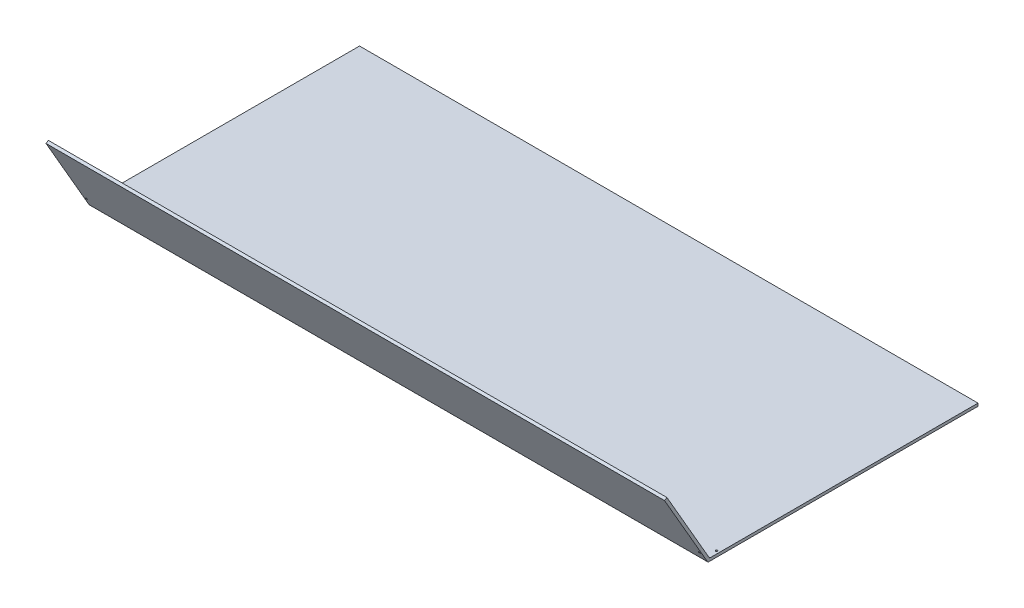
ISO-10303-21;
HEADER;
FILE_DESCRIPTION(('STEP AP214'),'2;1');
FILE_NAME('part.step','',(''),(''),'','','');
FILE_SCHEMA(('AUTOMOTIVE_DESIGN { 1 0 10303 214 1 1 1 1 }'));
ENDSEC;
DATA;
#1=APPLICATION_CONTEXT('core data for automotive mechanical design processes');
#2=APPLICATION_PROTOCOL_DEFINITION('international standard','automotive_design',2000,#1);
#3=PRODUCT_CONTEXT('',#1,'mechanical');
#4=PRODUCT('Part','Part','',(#3));
#5=PRODUCT_RELATED_PRODUCT_CATEGORY('part','',(#4));
#6=PRODUCT_DEFINITION_FORMATION('','',#4);
#7=PRODUCT_DEFINITION_CONTEXT('part definition',#1,'design');
#8=PRODUCT_DEFINITION('design','',#6,#7);
#9=PRODUCT_DEFINITION_SHAPE('','',#8);
#10=(LENGTH_UNIT() NAMED_UNIT(*) SI_UNIT(.MILLI.,.METRE.));
#11=(NAMED_UNIT(*) PLANE_ANGLE_UNIT() SI_UNIT($,.RADIAN.));
#12=(NAMED_UNIT(*) SI_UNIT($,.STERADIAN.) SOLID_ANGLE_UNIT());
#13=UNCERTAINTY_MEASURE_WITH_UNIT(LENGTH_MEASURE(1.E-05),#10,'distance_accuracy_value','');
#14=(GEOMETRIC_REPRESENTATION_CONTEXT(3) GLOBAL_UNCERTAINTY_ASSIGNED_CONTEXT((#13)) GLOBAL_UNIT_ASSIGNED_CONTEXT((#10,
#11,#12)) REPRESENTATION_CONTEXT('',''));
#15=CARTESIAN_POINT('',(0.,0.,0.));
#16=DIRECTION('',(0.,0.,1.));
#17=DIRECTION('',(1.,0.,0.));
#18=AXIS2_PLACEMENT_3D('',#15,#16,#17);
#19=CARTESIAN_POINT('',(525.018,4.7625,228.6));
#20=DIRECTION('',(-1.,0.,0.));
#21=DIRECTION('',(0.,0.,1.));
#22=AXIS2_PLACEMENT_3D('',#19,#20,#21);
#23=PLANE('',#22);
#24=DIRECTION('',(0.,0.,-1.));
#25=VECTOR('',#24,1.);
#26=CARTESIAN_POINT('',(525.018,4.7625,228.6));
#27=LINE('',#26,#25);
#28=CARTESIAN_POINT('',(525.018,4.7625,225.850369342984));
#29=VERTEX_POINT('',#28);
#30=CARTESIAN_POINT('',(525.018,4.7625,-228.6));
#31=VERTEX_POINT('',#30);
#32=EDGE_CURVE('E149',#29,#31,#27,.T.);
#33=ORIENTED_EDGE('',*,*,#32,.F.);
#34=CARTESIAN_POINT('',(525.018,7.14375,225.850369342984));
#35=DIRECTION('',(-1.,0.,0.));
#36=DIRECTION('',(0.,0.,1.));
#37=AXIS2_PLACEMENT_3D('',#34,#35,#36);
#38=CIRCLE('',#37,2.38125);
#39=CARTESIAN_POINT('',(525.018,5.95312499999997,227.912592335746));
#40=VERTEX_POINT('',#39);
#41=EDGE_CURVE('E43',#29,#40,#38,.T.);
#42=ORIENTED_EDGE('',*,*,#41,.T.);
#43=DIRECTION('',(0.,0.866025403784436,0.500000000000004));
#44=VECTOR('',#43,1.);
#45=CARTESIAN_POINT('',(525.018,3.57187499999997,226.537777007238));
#46=LINE('',#45,#44);
#47=CARTESIAN_POINT('',(525.018,130.054885222717,299.562777007239));
#48=VERTEX_POINT('',#47);
#49=EDGE_CURVE('E113',#40,#48,#46,.T.);
#50=ORIENTED_EDGE('',*,*,#49,.T.);
#51=DIRECTION('',(0.,0.500000000000004,-0.866025403784436));
#52=VECTOR('',#51,1.);
#53=CARTESIAN_POINT('',(525.018,28.3885923074525,475.653961753655));
#54=LINE('',#53,#52);
#55=CARTESIAN_POINT('',(525.018,127.673635222717,303.687222992762));
#56=VERTEX_POINT('',#55);
#57=EDGE_CURVE('E102',#56,#48,#54,.T.);
#58=ORIENTED_EDGE('',*,*,#57,.F.);
#59=DIRECTION('',(0.,0.866025403784436,0.500000000000004));
#60=VECTOR('',#59,1.);
#61=CARTESIAN_POINT('',(525.018,1.19062499999996,230.662222992762));
#62=LINE('',#61,#60);
#63=CARTESIAN_POINT('',(525.018,1.19062499999996,230.662222992762));
#64=VERTEX_POINT('',#63);
#65=EDGE_CURVE('E112',#64,#56,#62,.T.);
#66=ORIENTED_EDGE('',*,*,#65,.F.);
#67=CARTESIAN_POINT('',(525.018,2.38125,228.6));
#68=DIRECTION('',(-1.,0.,0.));
#69=DIRECTION('',(0.,0.,1.));
#70=AXIS2_PLACEMENT_3D('',#67,#68,#69);
#71=CIRCLE('',#70,2.38125);
#72=CARTESIAN_POINT('',(525.018,0.,228.6));
#73=VERTEX_POINT('',#72);
#74=EDGE_CURVE('E144',#64,#73,#71,.F.);
#75=ORIENTED_EDGE('',*,*,#74,.T.);
#76=DIRECTION('',(0.,0.,-1.));
#77=VECTOR('',#76,1.);
#78=CARTESIAN_POINT('',(525.018,0.,228.6));
#79=LINE('',#78,#77);
#80=CARTESIAN_POINT('',(525.018,0.,-228.6));
#81=VERTEX_POINT('',#80);
#82=EDGE_CURVE('E146',#73,#81,#79,.T.);
#83=ORIENTED_EDGE('',*,*,#82,.T.);
#84=DIRECTION('',(0.,-1.,0.));
#85=VECTOR('',#84,1.);
#86=CARTESIAN_POINT('',(525.018,4.7625,-228.6));
#87=LINE('',#86,#85);
#88=EDGE_CURVE('E168',#31,#81,#87,.T.);
#89=ORIENTED_EDGE('',*,*,#88,.F.);
#90=EDGE_LOOP('',(#33,#42,#50,#58,#66,#75,#83,#89));
#91=FACE_BOUND('',#90,.T.);
#92=ADVANCED_FACE('F35',(#91),#23,.F.);
#93=CARTESIAN_POINT('',(-525.018,4.7625,-228.6));
#94=DIRECTION('',(0.,0.,1.));
#95=DIRECTION('',(1.,0.,0.));
#96=AXIS2_PLACEMENT_3D('',#93,#94,#95);
#97=PLANE('',#96);
#98=DIRECTION('',(-1.,0.,0.));
#99=VECTOR('',#98,1.);
#100=CARTESIAN_POINT('',(-525.018,0.,-228.6));
#101=LINE('',#100,#99);
#102=CARTESIAN_POINT('',(-525.018,0.,-228.6));
#103=VERTEX_POINT('',#102);
#104=EDGE_CURVE('E160',#81,#103,#101,.T.);
#105=ORIENTED_EDGE('',*,*,#104,.T.);
#106=DIRECTION('',(0.,-1.,0.));
#107=VECTOR('',#106,1.);
#108=CARTESIAN_POINT('',(-525.018,4.7625,-228.6));
#109=LINE('',#108,#107);
#110=CARTESIAN_POINT('',(-525.018,4.7625,-228.6));
#111=VERTEX_POINT('',#110);
#112=EDGE_CURVE('E157',#111,#103,#109,.T.);
#113=ORIENTED_EDGE('',*,*,#112,.F.);
#114=DIRECTION('',(-1.,0.,0.));
#115=VECTOR('',#114,1.);
#116=CARTESIAN_POINT('',(-525.018,4.7625,-228.6));
#117=LINE('',#116,#115);
#118=EDGE_CURVE('E151',#31,#111,#117,.T.);
#119=ORIENTED_EDGE('',*,*,#118,.F.);
#120=ORIENTED_EDGE('',*,*,#88,.T.);
#121=EDGE_LOOP('',(#105,#113,#119,#120));
#122=FACE_BOUND('',#121,.T.);
#123=ADVANCED_FACE('F184',(#122),#97,.F.);
#124=CARTESIAN_POINT('',(-525.018,4.7625,228.6));
#125=DIRECTION('',(1.,0.,0.));
#126=DIRECTION('',(0.,0.,-1.));
#127=AXIS2_PLACEMENT_3D('',#124,#125,#126);
#128=PLANE('',#127);
#129=DIRECTION('',(0.,-0.866025403784436,-0.500000000000004));
#130=VECTOR('',#129,1.);
#131=CARTESIAN_POINT('',(-525.018,1.19062499999996,230.662222992762));
#132=LINE('',#131,#130);
#133=CARTESIAN_POINT('',(-525.018,127.673635222717,303.687222992762));
#134=VERTEX_POINT('',#133);
#135=CARTESIAN_POINT('',(-525.018,1.19062499999999,230.662222992762));
#136=VERTEX_POINT('',#135);
#137=EDGE_CURVE('E120',#134,#136,#132,.T.);
#138=ORIENTED_EDGE('',*,*,#137,.F.);
#139=DIRECTION('',(0.,0.500000000000004,-0.866025403784436));
#140=VECTOR('',#139,1.);
#141=CARTESIAN_POINT('',(-525.018,28.3885923074525,475.653961753655));
#142=LINE('',#141,#140);
#143=CARTESIAN_POINT('',(-525.018,130.054885222717,299.562777007239));
#144=VERTEX_POINT('',#143);
#145=EDGE_CURVE('E105',#134,#144,#142,.T.);
#146=ORIENTED_EDGE('',*,*,#145,.T.);
#147=DIRECTION('',(0.,-0.866025403784436,-0.500000000000004));
#148=VECTOR('',#147,1.);
#149=CARTESIAN_POINT('',(-525.018,3.57187499999997,226.537777007238));
#150=LINE('',#149,#148);
#151=CARTESIAN_POINT('',(-525.018,5.95312499999997,227.912592335746));
#152=VERTEX_POINT('',#151);
#153=EDGE_CURVE('E121',#144,#152,#150,.T.);
#154=ORIENTED_EDGE('',*,*,#153,.T.);
#155=CARTESIAN_POINT('',(-525.018,7.14375,225.850369342984));
#156=DIRECTION('',(1.,0.,0.));
#157=DIRECTION('',(0.,0.,-1.));
#158=AXIS2_PLACEMENT_3D('',#155,#156,#157);
#159=CIRCLE('',#158,2.38125);
#160=CARTESIAN_POINT('',(-525.018,4.7625,225.850369342984));
#161=VERTEX_POINT('',#160);
#162=EDGE_CURVE('E11',#152,#161,#159,.T.);
#163=ORIENTED_EDGE('',*,*,#162,.T.);
#164=DIRECTION('',(0.,0.,1.));
#165=VECTOR('',#164,1.);
#166=CARTESIAN_POINT('',(-525.018,4.7625,228.6));
#167=LINE('',#166,#165);
#168=EDGE_CURVE('E154',#111,#161,#167,.T.);
#169=ORIENTED_EDGE('',*,*,#168,.F.);
#170=ORIENTED_EDGE('',*,*,#112,.T.);
#171=DIRECTION('',(0.,0.,1.));
#172=VECTOR('',#171,1.);
#173=CARTESIAN_POINT('',(-525.018,0.,228.6));
#174=LINE('',#173,#172);
#175=CARTESIAN_POINT('',(-525.018,0.,228.6));
#176=VERTEX_POINT('',#175);
#177=EDGE_CURVE('E162',#103,#176,#174,.T.);
#178=ORIENTED_EDGE('',*,*,#177,.T.);
#179=CARTESIAN_POINT('',(-525.018,2.38125,228.6));
#180=DIRECTION('',(-1.,0.,0.));
#181=DIRECTION('',(0.,0.,1.));
#182=AXIS2_PLACEMENT_3D('',#179,#180,#181);
#183=CIRCLE('',#182,2.38125);
#184=EDGE_CURVE('E135',#176,#136,#183,.T.);
#185=ORIENTED_EDGE('',*,*,#184,.T.);
#186=EDGE_LOOP('',(#138,#146,#154,#163,#169,#170,#178,#185));
#187=FACE_BOUND('',#186,.T.);
#188=ADVANCED_FACE('F188',(#187),#128,.F.);
#189=CARTESIAN_POINT('',(0.,4.7625,0.));
#190=DIRECTION('',(0.,-1.,0.));
#191=DIRECTION('',(0.,0.,-1.));
#192=AXIS2_PLACEMENT_3D('',#189,#190,#191);
#193=PLANE('',#192);
#194=CARTESIAN_POINT('',(520.2555,4.7625,210.3923148));
#195=DIRECTION('',(0.,1.,0.));
#196=DIRECTION('',(0.,0.,1.));
#197=AXIS2_PLACEMENT_3D('',#194,#195,#196);
#198=CIRCLE('',#197,1.58750000000005);
#199=CARTESIAN_POINT('',(520.2555,4.7625,211.9798148));
#200=VERTEX_POINT('',#199);
#201=EDGE_CURVE('E136',#200,#200,#198,.T.);
#202=ORIENTED_EDGE('',*,*,#201,.F.);
#203=EDGE_LOOP('',(#202));
#204=FACE_BOUND('',#203,.T.);
#205=CARTESIAN_POINT('',(-520.2555,4.7625,210.3923148));
#206=DIRECTION('',(0.,1.,0.));
#207=DIRECTION('',(0.,0.,1.));
#208=AXIS2_PLACEMENT_3D('',#205,#206,#207);
#209=CIRCLE('',#208,1.58750000000005);
#210=CARTESIAN_POINT('',(-520.2555,4.7625,211.9798148));
#211=VERTEX_POINT('',#210);
#212=EDGE_CURVE('E130',#211,#211,#209,.T.);
#213=ORIENTED_EDGE('',*,*,#212,.F.);
#214=EDGE_LOOP('',(#213));
#215=FACE_BOUND('',#214,.T.);
#216=ORIENTED_EDGE('',*,*,#168,.T.);
#217=DIRECTION('',(1.,0.,0.));
#218=VECTOR('',#217,1.);
#219=CARTESIAN_POINT('',(0.,4.7625,225.850369342984));
#220=LINE('',#219,#218);
#221=EDGE_CURVE('E171',#161,#29,#220,.T.);
#222=ORIENTED_EDGE('',*,*,#221,.T.);
#223=ORIENTED_EDGE('',*,*,#32,.T.);
#224=ORIENTED_EDGE('',*,*,#118,.T.);
#225=EDGE_LOOP('',(#216,#222,#223,#224));
#226=FACE_BOUND('',#225,.T.);
#227=ADVANCED_FACE('F176',(#204,#215,#226),#193,.F.);
#228=CARTESIAN_POINT('',(0.,0.,0.));
#229=DIRECTION('',(0.,-1.,0.));
#230=DIRECTION('',(0.,0.,-1.));
#231=AXIS2_PLACEMENT_3D('',#228,#229,#230);
#232=PLANE('',#231);
#233=CARTESIAN_POINT('',(520.2555,0.,210.3923148));
#234=DIRECTION('',(0.,1.,0.));
#235=DIRECTION('',(0.,0.,1.));
#236=AXIS2_PLACEMENT_3D('',#233,#234,#235);
#237=CIRCLE('',#236,1.58750000000005);
#238=CARTESIAN_POINT('',(520.2555,0.,211.9798148));
#239=VERTEX_POINT('',#238);
#240=EDGE_CURVE('E132',#239,#239,#237,.T.);
#241=ORIENTED_EDGE('',*,*,#240,.T.);
#242=EDGE_LOOP('',(#241));
#243=FACE_BOUND('',#242,.T.);
#244=CARTESIAN_POINT('',(-520.2555,0.,210.3923148));
#245=DIRECTION('',(0.,1.,0.));
#246=DIRECTION('',(0.,0.,1.));
#247=AXIS2_PLACEMENT_3D('',#244,#245,#246);
#248=CIRCLE('',#247,1.58750000000005);
#249=CARTESIAN_POINT('',(-520.2555,0.,211.9798148));
#250=VERTEX_POINT('',#249);
#251=EDGE_CURVE('E139',#250,#250,#248,.T.);
#252=ORIENTED_EDGE('',*,*,#251,.T.);
#253=EDGE_LOOP('',(#252));
#254=FACE_BOUND('',#253,.T.);
#255=ORIENTED_EDGE('',*,*,#82,.F.);
#256=DIRECTION('',(1.,0.,0.));
#257=VECTOR('',#256,1.);
#258=CARTESIAN_POINT('',(-525.018,0.,228.6));
#259=LINE('',#258,#257);
#260=EDGE_CURVE('E152',#176,#73,#259,.T.);
#261=ORIENTED_EDGE('',*,*,#260,.F.);
#262=ORIENTED_EDGE('',*,*,#177,.F.);
#263=ORIENTED_EDGE('',*,*,#104,.F.);
#264=EDGE_LOOP('',(#255,#261,#262,#263));
#265=FACE_BOUND('',#264,.T.);
#266=ADVANCED_FACE('F203',(#243,#254,#265),#232,.T.);
#267=CARTESIAN_POINT('',(530.342636871421,2.38125,228.6));
#268=DIRECTION('',(-1.,0.,0.));
#269=DIRECTION('',(0.,0.,1.));
#270=AXIS2_PLACEMENT_3D('',#267,#268,#269);
#271=CYLINDRICAL_SURFACE('',#270,2.38125);
#272=DIRECTION('',(1.,0.,0.));
#273=VECTOR('',#272,1.);
#274=CARTESIAN_POINT('',(-525.018,1.19062499999996,230.662222992762));
#275=LINE('',#274,#273);
#276=EDGE_CURVE('E119',#136,#64,#275,.T.);
#277=ORIENTED_EDGE('',*,*,#276,.F.);
#278=ORIENTED_EDGE('',*,*,#184,.F.);
#279=ORIENTED_EDGE('',*,*,#260,.T.);
#280=ORIENTED_EDGE('',*,*,#74,.F.);
#281=EDGE_LOOP('',(#277,#278,#279,#280));
#282=FACE_BOUND('',#281,.T.);
#283=ADVANCED_FACE('F206',(#282),#271,.T.);
#284=CARTESIAN_POINT('',(-520.2555,0.,210.3923148));
#285=DIRECTION('',(0.,1.,0.));
#286=DIRECTION('',(0.,0.,1.));
#287=AXIS2_PLACEMENT_3D('',#284,#285,#286);
#288=CYLINDRICAL_SURFACE('',#287,1.58750000000005);
#289=CARTESIAN_POINT('',(-520.2555,0.,211.9798148));
#290=CARTESIAN_POINT('',(-520.2555,0.049609375,211.9798148));
#291=CARTESIAN_POINT('',(-520.2555,0.09921875,211.9798148));
#292=CARTESIAN_POINT('',(-520.2555,0.1984375,211.9798148));
#293=CARTESIAN_POINT('',(-520.2555,0.248046875,211.9798148));
#294=CARTESIAN_POINT('',(-520.2555,0.347265625,211.9798148));
#295=CARTESIAN_POINT('',(-520.2555,0.396875,211.9798148));
#296=CARTESIAN_POINT('',(-520.2555,0.49609375,211.9798148));
#297=CARTESIAN_POINT('',(-520.2555,0.545703125,211.9798148));
#298=CARTESIAN_POINT('',(-520.2555,0.644921875,211.9798148));
#299=CARTESIAN_POINT('',(-520.2555,0.69453125,211.9798148));
#300=CARTESIAN_POINT('',(-520.2555,0.79375,211.9798148));
#301=CARTESIAN_POINT('',(-520.2555,0.843359375,211.9798148));
#302=CARTESIAN_POINT('',(-520.2555,0.942578125,211.9798148));
#303=CARTESIAN_POINT('',(-520.2555,0.9921875,211.9798148));
#304=CARTESIAN_POINT('',(-520.2555,1.09140625,211.9798148));
#305=CARTESIAN_POINT('',(-520.2555,1.141015625,211.9798148));
#306=CARTESIAN_POINT('',(-520.2555,1.240234375,211.9798148));
#307=CARTESIAN_POINT('',(-520.2555,1.28984375,211.9798148));
#308=CARTESIAN_POINT('',(-520.2555,1.3890625,211.9798148));
#309=CARTESIAN_POINT('',(-520.2555,1.438671875,211.9798148));
#310=CARTESIAN_POINT('',(-520.2555,1.537890625,211.9798148));
#311=CARTESIAN_POINT('',(-520.2555,1.5875,211.9798148));
#312=CARTESIAN_POINT('',(-520.2555,1.68671875,211.9798148));
#313=CARTESIAN_POINT('',(-520.2555,1.736328125,211.9798148));
#314=CARTESIAN_POINT('',(-520.2555,1.835546875,211.9798148));
#315=CARTESIAN_POINT('',(-520.2555,1.88515625,211.9798148));
#316=CARTESIAN_POINT('',(-520.2555,1.984375,211.9798148));
#317=CARTESIAN_POINT('',(-520.2555,2.033984375,211.9798148));
#318=CARTESIAN_POINT('',(-520.2555,2.133203125,211.9798148));
#319=CARTESIAN_POINT('',(-520.2555,2.1828125,211.9798148));
#320=CARTESIAN_POINT('',(-520.2555,2.28203125,211.9798148));
#321=CARTESIAN_POINT('',(-520.2555,2.331640625,211.9798148));
#322=CARTESIAN_POINT('',(-520.2555,2.430859375,211.9798148));
#323=CARTESIAN_POINT('',(-520.2555,2.48046875,211.9798148));
#324=CARTESIAN_POINT('',(-520.2555,2.5796875,211.9798148));
#325=CARTESIAN_POINT('',(-520.2555,2.629296875,211.9798148));
#326=CARTESIAN_POINT('',(-520.2555,2.728515625,211.9798148));
#327=CARTESIAN_POINT('',(-520.2555,2.778125,211.9798148));
#328=CARTESIAN_POINT('',(-520.2555,2.87734375,211.9798148));
#329=CARTESIAN_POINT('',(-520.2555,2.926953125,211.9798148));
#330=CARTESIAN_POINT('',(-520.2555,3.026171875,211.9798148));
#331=CARTESIAN_POINT('',(-520.2555,3.07578125,211.9798148));
#332=CARTESIAN_POINT('',(-520.2555,3.175,211.9798148));
#333=CARTESIAN_POINT('',(-520.2555,3.224609375,211.9798148));
#334=CARTESIAN_POINT('',(-520.2555,3.323828125,211.9798148));
#335=CARTESIAN_POINT('',(-520.2555,3.3734375,211.9798148));
#336=CARTESIAN_POINT('',(-520.2555,3.47265625,211.9798148));
#337=CARTESIAN_POINT('',(-520.2555,3.522265625,211.9798148));
#338=CARTESIAN_POINT('',(-520.2555,3.621484375,211.9798148));
#339=CARTESIAN_POINT('',(-520.2555,3.67109375,211.9798148));
#340=CARTESIAN_POINT('',(-520.2555,3.7703125,211.9798148));
#341=CARTESIAN_POINT('',(-520.2555,3.819921875,211.9798148));
#342=CARTESIAN_POINT('',(-520.2555,3.919140625,211.9798148));
#343=CARTESIAN_POINT('',(-520.2555,3.96875,211.9798148));
#344=CARTESIAN_POINT('',(-520.2555,4.06796875,211.9798148));
#345=CARTESIAN_POINT('',(-520.2555,4.117578125,211.9798148));
#346=CARTESIAN_POINT('',(-520.2555,4.216796875,211.9798148));
#347=CARTESIAN_POINT('',(-520.2555,4.26640625,211.9798148));
#348=CARTESIAN_POINT('',(-520.2555,4.365625,211.9798148));
#349=CARTESIAN_POINT('',(-520.2555,4.415234375,211.9798148));
#350=CARTESIAN_POINT('',(-520.2555,4.514453125,211.9798148));
#351=CARTESIAN_POINT('',(-520.2555,4.5640625,211.9798148));
#352=CARTESIAN_POINT('',(-520.2555,4.66328125,211.9798148));
#353=CARTESIAN_POINT('',(-520.2555,4.712890625,211.9798148));
#354=CARTESIAN_POINT('',(-520.2555,4.7625,211.9798148));
#355=B_SPLINE_CURVE_WITH_KNOTS('',3,(#289,#290,#291,#292,#293,#294,#295,#296,#297,#298,#299,
#300,#301,#302,#303,#304,#305,#306,#307,#308,#309,#310,#311,#312,#313,#314,#315,#316,#317,#318,
#319,#320,#321,#322,#323,#324,#325,#326,#327,#328,#329,#330,#331,#332,#333,#334,#335,#336,#337,
#338,#339,#340,#341,#342,#343,#344,#345,#346,#347,#348,#349,#350,#351,#352,#353,#354),
.UNSPECIFIED.,.F.,.F.,(4,2,2,2,2,2,2,2,2,2,2,2,2,2,2,2,2,2,2,2,2,2,2,2,2,2,2,2,2,2,2,2,4),(0.,
0.148828125,0.29765625,0.446484375,0.5953125,0.744140625,0.89296875,1.041796875,1.190625,
1.339453125,1.48828125,1.637109375,1.7859375,1.934765625,2.08359375,2.232421875,2.38125,
2.530078125,2.67890625,2.827734375,2.9765625,3.125390625,3.27421875,3.423046875,3.571875,
3.720703125,3.86953125,4.018359375,4.1671875,4.316015625,4.46484375,4.613671875,4.7625),.UNSPECIFIED.);
#356=EDGE_CURVE('BSEAM213',#250,#211,#355,.T.);
#357=ORIENTED_EDGE('',*,*,#251,.F.);
#358=ORIENTED_EDGE('',*,*,#212,.T.);
#359=ORIENTED_EDGE('',*,*,#356,.T.);
#360=ORIENTED_EDGE('',*,*,#356,.F.);
#361=EDGE_LOOP('',(#357,#359,#358,#360));
#362=FACE_BOUND('',#361,.T.);
#363=ADVANCED_FACE('F213',(#362),#288,.F.);
#364=CARTESIAN_POINT('',(520.2555,0.,210.3923148));
#365=DIRECTION('',(0.,1.,0.));
#366=DIRECTION('',(0.,0.,1.));
#367=AXIS2_PLACEMENT_3D('',#364,#365,#366);
#368=CYLINDRICAL_SURFACE('',#367,1.58750000000005);
#369=CARTESIAN_POINT('',(520.2555,0.,211.9798148));
#370=CARTESIAN_POINT('',(520.2555,0.049609375,211.9798148));
#371=CARTESIAN_POINT('',(520.2555,0.09921875,211.9798148));
#372=CARTESIAN_POINT('',(520.2555,0.1984375,211.9798148));
#373=CARTESIAN_POINT('',(520.2555,0.248046875,211.9798148));
#374=CARTESIAN_POINT('',(520.2555,0.347265625,211.9798148));
#375=CARTESIAN_POINT('',(520.2555,0.396875,211.9798148));
#376=CARTESIAN_POINT('',(520.2555,0.49609375,211.9798148));
#377=CARTESIAN_POINT('',(520.2555,0.545703125,211.9798148));
#378=CARTESIAN_POINT('',(520.2555,0.644921875,211.9798148));
#379=CARTESIAN_POINT('',(520.2555,0.69453125,211.9798148));
#380=CARTESIAN_POINT('',(520.2555,0.79375,211.9798148));
#381=CARTESIAN_POINT('',(520.2555,0.843359375,211.9798148));
#382=CARTESIAN_POINT('',(520.2555,0.942578125,211.9798148));
#383=CARTESIAN_POINT('',(520.2555,0.9921875,211.9798148));
#384=CARTESIAN_POINT('',(520.2555,1.09140625,211.9798148));
#385=CARTESIAN_POINT('',(520.2555,1.141015625,211.9798148));
#386=CARTESIAN_POINT('',(520.2555,1.240234375,211.9798148));
#387=CARTESIAN_POINT('',(520.2555,1.28984375,211.9798148));
#388=CARTESIAN_POINT('',(520.2555,1.3890625,211.9798148));
#389=CARTESIAN_POINT('',(520.2555,1.438671875,211.9798148));
#390=CARTESIAN_POINT('',(520.2555,1.537890625,211.9798148));
#391=CARTESIAN_POINT('',(520.2555,1.5875,211.9798148));
#392=CARTESIAN_POINT('',(520.2555,1.68671875,211.9798148));
#393=CARTESIAN_POINT('',(520.2555,1.736328125,211.9798148));
#394=CARTESIAN_POINT('',(520.2555,1.835546875,211.9798148));
#395=CARTESIAN_POINT('',(520.2555,1.88515625,211.9798148));
#396=CARTESIAN_POINT('',(520.2555,1.984375,211.9798148));
#397=CARTESIAN_POINT('',(520.2555,2.033984375,211.9798148));
#398=CARTESIAN_POINT('',(520.2555,2.133203125,211.9798148));
#399=CARTESIAN_POINT('',(520.2555,2.1828125,211.9798148));
#400=CARTESIAN_POINT('',(520.2555,2.28203125,211.9798148));
#401=CARTESIAN_POINT('',(520.2555,2.331640625,211.9798148));
#402=CARTESIAN_POINT('',(520.2555,2.430859375,211.9798148));
#403=CARTESIAN_POINT('',(520.2555,2.48046875,211.9798148));
#404=CARTESIAN_POINT('',(520.2555,2.5796875,211.9798148));
#405=CARTESIAN_POINT('',(520.2555,2.629296875,211.9798148));
#406=CARTESIAN_POINT('',(520.2555,2.728515625,211.9798148));
#407=CARTESIAN_POINT('',(520.2555,2.778125,211.9798148));
#408=CARTESIAN_POINT('',(520.2555,2.87734375,211.9798148));
#409=CARTESIAN_POINT('',(520.2555,2.926953125,211.9798148));
#410=CARTESIAN_POINT('',(520.2555,3.026171875,211.9798148));
#411=CARTESIAN_POINT('',(520.2555,3.07578125,211.9798148));
#412=CARTESIAN_POINT('',(520.2555,3.175,211.9798148));
#413=CARTESIAN_POINT('',(520.2555,3.224609375,211.9798148));
#414=CARTESIAN_POINT('',(520.2555,3.323828125,211.9798148));
#415=CARTESIAN_POINT('',(520.2555,3.3734375,211.9798148));
#416=CARTESIAN_POINT('',(520.2555,3.47265625,211.9798148));
#417=CARTESIAN_POINT('',(520.2555,3.522265625,211.9798148));
#418=CARTESIAN_POINT('',(520.2555,3.621484375,211.9798148));
#419=CARTESIAN_POINT('',(520.2555,3.67109375,211.9798148));
#420=CARTESIAN_POINT('',(520.2555,3.7703125,211.9798148));
#421=CARTESIAN_POINT('',(520.2555,3.819921875,211.9798148));
#422=CARTESIAN_POINT('',(520.2555,3.919140625,211.9798148));
#423=CARTESIAN_POINT('',(520.2555,3.96875,211.9798148));
#424=CARTESIAN_POINT('',(520.2555,4.06796875,211.9798148));
#425=CARTESIAN_POINT('',(520.2555,4.117578125,211.9798148));
#426=CARTESIAN_POINT('',(520.2555,4.216796875,211.9798148));
#427=CARTESIAN_POINT('',(520.2555,4.26640625,211.9798148));
#428=CARTESIAN_POINT('',(520.2555,4.365625,211.9798148));
#429=CARTESIAN_POINT('',(520.2555,4.415234375,211.9798148));
#430=CARTESIAN_POINT('',(520.2555,4.514453125,211.9798148));
#431=CARTESIAN_POINT('',(520.2555,4.5640625,211.9798148));
#432=CARTESIAN_POINT('',(520.2555,4.66328125,211.9798148));
#433=CARTESIAN_POINT('',(520.2555,4.712890625,211.9798148));
#434=CARTESIAN_POINT('',(520.2555,4.7625,211.9798148));
#435=B_SPLINE_CURVE_WITH_KNOTS('',3,(#369,#370,#371,#372,#373,#374,#375,#376,#377,#378,#379,
#380,#381,#382,#383,#384,#385,#386,#387,#388,#389,#390,#391,#392,#393,#394,#395,#396,#397,#398,
#399,#400,#401,#402,#403,#404,#405,#406,#407,#408,#409,#410,#411,#412,#413,#414,#415,#416,#417,
#418,#419,#420,#421,#422,#423,#424,#425,#426,#427,#428,#429,#430,#431,#432,#433,#434),
.UNSPECIFIED.,.F.,.F.,(4,2,2,2,2,2,2,2,2,2,2,2,2,2,2,2,2,2,2,2,2,2,2,2,2,2,2,2,2,2,2,2,4),(0.,
0.148828125,0.29765625,0.446484375,0.5953125,0.744140625,0.89296875,1.041796875,1.190625,
1.339453125,1.48828125,1.637109375,1.7859375,1.934765625,2.08359375,2.232421875,2.38125,
2.530078125,2.67890625,2.827734375,2.9765625,3.125390625,3.27421875,3.423046875,3.571875,
3.720703125,3.86953125,4.018359375,4.1671875,4.316015625,4.46484375,4.613671875,4.7625),.UNSPECIFIED.);
#436=EDGE_CURVE('BSEAM217',#239,#200,#435,.T.);
#437=ORIENTED_EDGE('',*,*,#240,.F.);
#438=ORIENTED_EDGE('',*,*,#201,.T.);
#439=ORIENTED_EDGE('',*,*,#436,.T.);
#440=ORIENTED_EDGE('',*,*,#436,.F.);
#441=EDGE_LOOP('',(#437,#439,#438,#440));
#442=FACE_BOUND('',#441,.T.);
#443=ADVANCED_FACE('F217',(#442),#368,.F.);
#444=CARTESIAN_POINT('',(0.,201.545282305122,340.837777007239));
#445=DIRECTION('',(0.,0.500000000000004,-0.866025403784436));
#446=DIRECTION('',(0.,0.866025403784436,0.500000000000004));
#447=AXIS2_PLACEMENT_3D('',#444,#445,#446);
#448=PLANE('',#447);
#449=ORIENTED_EDGE('',*,*,#49,.F.);
#450=DIRECTION('',(1.,0.,0.));
#451=VECTOR('',#450,1.);
#452=CARTESIAN_POINT('',(0.,5.953125,227.912592335746));
#453=LINE('',#452,#451);
#454=EDGE_CURVE('E50',#40,#152,#453,.F.);
#455=ORIENTED_EDGE('',*,*,#454,.T.);
#456=ORIENTED_EDGE('',*,*,#153,.F.);
#457=DIRECTION('',(-1.,0.,0.));
#458=VECTOR('',#457,1.);
#459=CARTESIAN_POINT('',(525.018,130.054885222717,299.562777007239));
#460=LINE('',#459,#458);
#461=EDGE_CURVE('E114',#48,#144,#460,.T.);
#462=ORIENTED_EDGE('',*,*,#461,.F.);
#463=EDGE_LOOP('',(#449,#455,#456,#462));
#464=FACE_BOUND('',#463,.T.);
#465=CARTESIAN_POINT('',(520.2555,19.3401929273099,235.641619607238));
#466=DIRECTION('',(0.,0.500000000000004,-0.866025403784436));
#467=DIRECTION('',(0.,0.866025403784436,0.500000000000004));
#468=AXIS2_PLACEMENT_3D('',#465,#466,#467);
#469=CIRCLE('',#468,1.58750000000005);
#470=CARTESIAN_POINT('',(520.2555,20.7150082558177,236.435369607238));
#471=VERTEX_POINT('',#470);
#472=EDGE_CURVE('E126',#471,#471,#469,.T.);
#473=ORIENTED_EDGE('',*,*,#472,.F.);
#474=EDGE_LOOP('',(#473));
#475=FACE_BOUND('',#474,.T.);
#476=CARTESIAN_POINT('',(-520.2555,19.3401929273099,235.641619607238));
#477=DIRECTION('',(0.,0.500000000000004,-0.866025403784436));
#478=DIRECTION('',(0.,0.866025403784436,0.500000000000004));
#479=AXIS2_PLACEMENT_3D('',#476,#477,#478);
#480=CIRCLE('',#479,1.58750000000005);
#481=CARTESIAN_POINT('',(-520.2555,20.7150082558177,236.435369607238));
#482=VERTEX_POINT('',#481);
#483=EDGE_CURVE('E242',#482,#482,#480,.T.);
#484=ORIENTED_EDGE('',*,*,#483,.F.);
#485=EDGE_LOOP('',(#484));
#486=FACE_BOUND('',#485,.T.);
#487=ADVANCED_FACE('F221',(#464,#475,#486),#448,.T.);
#488=CARTESIAN_POINT('',(0.,199.164032305122,344.962222992763));
#489=DIRECTION('',(0.,0.500000000000004,-0.866025403784436));
#490=DIRECTION('',(0.,0.866025403784436,0.500000000000004));
#491=AXIS2_PLACEMENT_3D('',#488,#489,#490);
#492=PLANE('',#491);
#493=CARTESIAN_POINT('',(520.2555,16.9589429273098,239.766065592762));
#494=DIRECTION('',(0.,-0.500000000000004,0.866025403784436));
#495=DIRECTION('',(0.,-0.866025403784436,-0.500000000000004));
#496=AXIS2_PLACEMENT_3D('',#493,#494,#495);
#497=CIRCLE('',#496,1.58750000000005);
#498=CARTESIAN_POINT('',(520.2555,15.584127598802,238.972315592762));
#499=VERTEX_POINT('',#498);
#500=EDGE_CURVE('E241',#499,#499,#497,.T.);
#501=ORIENTED_EDGE('',*,*,#500,.F.);
#502=EDGE_LOOP('',(#501));
#503=FACE_BOUND('',#502,.T.);
#504=CARTESIAN_POINT('',(-520.2555,16.9589429273098,239.766065592762));
#505=DIRECTION('',(0.,-0.500000000000004,0.866025403784436));
#506=DIRECTION('',(0.,-0.866025403784436,-0.500000000000004));
#507=AXIS2_PLACEMENT_3D('',#504,#505,#506);
#508=CIRCLE('',#507,1.58750000000005);
#509=CARTESIAN_POINT('',(-520.2555,15.584127598802,238.972315592762));
#510=VERTEX_POINT('',#509);
#511=EDGE_CURVE('E109',#510,#510,#508,.T.);
#512=ORIENTED_EDGE('',*,*,#511,.F.);
#513=EDGE_LOOP('',(#512));
#514=FACE_BOUND('',#513,.T.);
#515=ORIENTED_EDGE('',*,*,#65,.T.);
#516=DIRECTION('',(1.,0.,0.));
#517=VECTOR('',#516,1.);
#518=CARTESIAN_POINT('',(525.018,127.673635222717,303.687222992762));
#519=LINE('',#518,#517);
#520=EDGE_CURVE('E99',#134,#56,#519,.T.);
#521=ORIENTED_EDGE('',*,*,#520,.F.);
#522=ORIENTED_EDGE('',*,*,#137,.T.);
#523=ORIENTED_EDGE('',*,*,#276,.T.);
#524=EDGE_LOOP('',(#515,#521,#522,#523));
#525=FACE_BOUND('',#524,.T.);
#526=ADVANCED_FACE('F117',(#503,#514,#525),#492,.F.);
#527=CARTESIAN_POINT('',(-520.2555,315.407335134996,-277.161713148189));
#528=DIRECTION('',(0.,-0.500000000000004,0.866025403784436));
#529=DIRECTION('',(0.,-0.866025403784436,-0.500000000000004));
#530=AXIS2_PLACEMENT_3D('',#527,#528,#529);
#531=CYLINDRICAL_SURFACE('',#530,1.58750000000005);
#532=ORIENTED_EDGE('',*,*,#483,.T.);
#533=EDGE_LOOP('',(#532));
#534=FACE_BOUND('',#533,.T.);
#535=ORIENTED_EDGE('',*,*,#511,.T.);
#536=EDGE_LOOP('',(#535));
#537=FACE_BOUND('',#536,.T.);
#538=ADVANCED_FACE('F227',(#534,#537),#531,.F.);
#539=CARTESIAN_POINT('',(520.2555,315.407335134996,-277.161713148189));
#540=DIRECTION('',(0.,-0.500000000000004,0.866025403784436));
#541=DIRECTION('',(0.,-0.866025403784436,-0.500000000000004));
#542=AXIS2_PLACEMENT_3D('',#539,#540,#541);
#543=CYLINDRICAL_SURFACE('',#542,1.58750000000005);
#544=ORIENTED_EDGE('',*,*,#472,.T.);
#545=EDGE_LOOP('',(#544));
#546=FACE_BOUND('',#545,.T.);
#547=ORIENTED_EDGE('',*,*,#500,.T.);
#548=EDGE_LOOP('',(#547));
#549=FACE_BOUND('',#548,.T.);
#550=ADVANCED_FACE('F193',(#546,#549),#543,.F.);
#551=CARTESIAN_POINT('',(525.018,28.3885923074525,475.653961753655));
#552=DIRECTION('',(0.,-0.866025403784436,-0.500000000000004));
#553=DIRECTION('',(0.,0.500000000000004,-0.866025403784436));
#554=AXIS2_PLACEMENT_3D('',#551,#552,#553);
#555=PLANE('',#554);
#556=ORIENTED_EDGE('',*,*,#520,.T.);
#557=ORIENTED_EDGE('',*,*,#57,.T.);
#558=ORIENTED_EDGE('',*,*,#461,.T.);
#559=ORIENTED_EDGE('',*,*,#145,.F.);
#560=EDGE_LOOP('',(#556,#557,#558,#559));
#561=FACE_BOUND('',#560,.T.);
#562=ADVANCED_FACE('F101',(#561),#555,.F.);
#563=CARTESIAN_POINT('',(0.,7.14375,225.850369342984));
#564=DIRECTION('',(1.,0.,0.));
#565=DIRECTION('',(0.,0.,-1.));
#566=AXIS2_PLACEMENT_3D('',#563,#564,#565);
#567=CYLINDRICAL_SURFACE('',#566,2.38125);
#568=ORIENTED_EDGE('',*,*,#162,.F.);
#569=ORIENTED_EDGE('',*,*,#454,.F.);
#570=ORIENTED_EDGE('',*,*,#41,.F.);
#571=ORIENTED_EDGE('',*,*,#221,.F.);
#572=EDGE_LOOP('',(#568,#569,#570,#571));
#573=FACE_BOUND('',#572,.T.);
#574=ADVANCED_FACE('F37',(#573),#567,.F.);
#575=CLOSED_SHELL('',(#92,#123,#188,#227,#266,#283,#363,#443,#487,#526,#538,#550,#562,#574));
#576=MANIFOLD_SOLID_BREP('B2',#575);
#577=ADVANCED_BREP_SHAPE_REPRESENTATION('',(#18,#576),#14);
#578=SHAPE_DEFINITION_REPRESENTATION(#9,#577);
ENDSEC;
END-ISO-10303-21;
